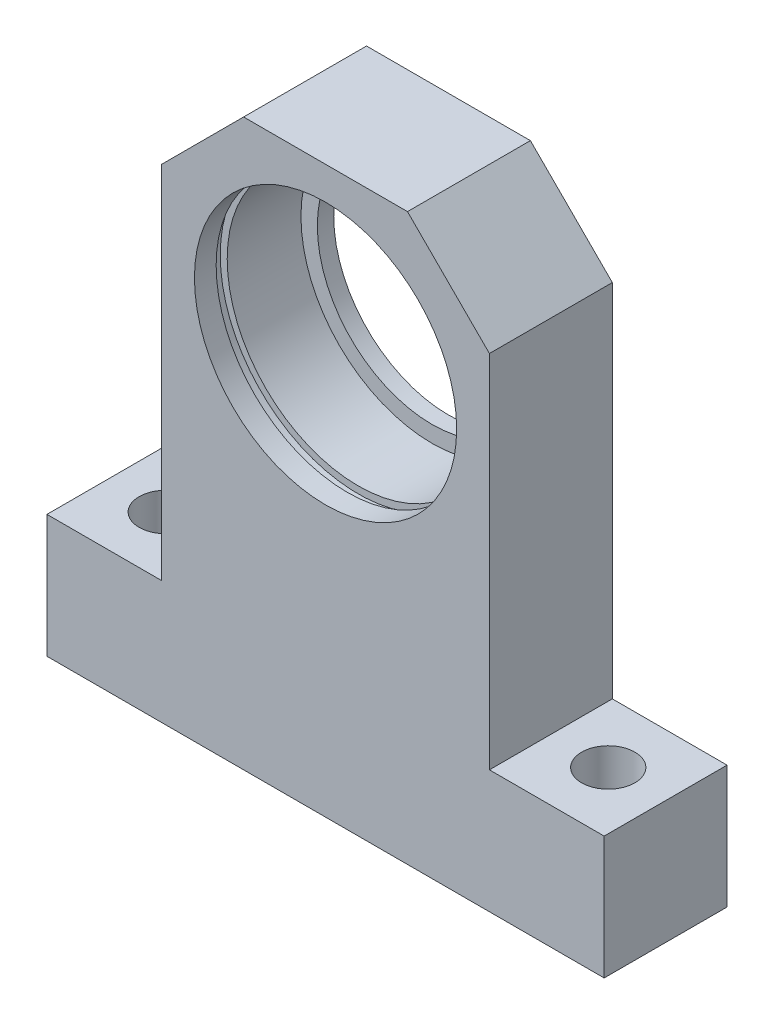
ISO-10303-21;
HEADER;
FILE_DESCRIPTION(('STEP AP214'),'2;1');
FILE_NAME('part.step','',(''),(''),'','','');
FILE_SCHEMA(('AUTOMOTIVE_DESIGN { 1 0 10303 214 1 1 1 1 }'));
ENDSEC;
DATA;
#1=APPLICATION_CONTEXT('core data for automotive mechanical design processes');
#2=APPLICATION_PROTOCOL_DEFINITION('international standard','automotive_design',2000,#1);
#3=PRODUCT_CONTEXT('',#1,'mechanical');
#4=PRODUCT('Part','Part','',(#3));
#5=PRODUCT_RELATED_PRODUCT_CATEGORY('part','',(#4));
#6=PRODUCT_DEFINITION_FORMATION('','',#4);
#7=PRODUCT_DEFINITION_CONTEXT('part definition',#1,'design');
#8=PRODUCT_DEFINITION('design','',#6,#7);
#9=PRODUCT_DEFINITION_SHAPE('','',#8);
#10=(LENGTH_UNIT() NAMED_UNIT(*) SI_UNIT(.MILLI.,.METRE.));
#11=(NAMED_UNIT(*) PLANE_ANGLE_UNIT() SI_UNIT($,.RADIAN.));
#12=(NAMED_UNIT(*) SI_UNIT($,.STERADIAN.) SOLID_ANGLE_UNIT());
#13=UNCERTAINTY_MEASURE_WITH_UNIT(LENGTH_MEASURE(1.E-05),#10,'distance_accuracy_value','');
#14=(GEOMETRIC_REPRESENTATION_CONTEXT(3) GLOBAL_UNCERTAINTY_ASSIGNED_CONTEXT((#13)) GLOBAL_UNIT_ASSIGNED_CONTEXT((#10,
#11,#12)) REPRESENTATION_CONTEXT('',''));
#15=CARTESIAN_POINT('',(0.,0.,0.));
#16=DIRECTION('',(0.,0.,1.));
#17=DIRECTION('',(1.,0.,0.));
#18=AXIS2_PLACEMENT_3D('',#15,#16,#17);
#19=CARTESIAN_POINT('',(-20.,15.,-15.));
#20=DIRECTION('',(-1.,0.,0.));
#21=DIRECTION('',(0.,-1.,0.));
#22=AXIS2_PLACEMENT_3D('',#19,#20,#21);
#23=PLANE('',#22);
#24=DIRECTION('',(0.,-1.,0.));
#25=VECTOR('',#24,1.);
#26=CARTESIAN_POINT('',(-20.,15.,0.));
#27=LINE('',#26,#25);
#28=CARTESIAN_POINT('',(-20.,59.,0.));
#29=VERTEX_POINT('',#28);
#30=CARTESIAN_POINT('',(-20.,15.,0.));
#31=VERTEX_POINT('',#30);
#32=EDGE_CURVE('E146',#29,#31,#27,.T.);
#33=ORIENTED_EDGE('',*,*,#32,.F.);
#34=DIRECTION('',(0.,0.,-1.));
#35=VECTOR('',#34,1.);
#36=CARTESIAN_POINT('',(-20.,59.,-15.));
#37=LINE('',#36,#35);
#38=CARTESIAN_POINT('',(-20.,59.,-15.));
#39=VERTEX_POINT('',#38);
#40=EDGE_CURVE('E11',#29,#39,#37,.T.);
#41=ORIENTED_EDGE('',*,*,#40,.T.);
#42=DIRECTION('',(0.,-1.,0.));
#43=VECTOR('',#42,1.);
#44=CARTESIAN_POINT('',(-20.,15.,-15.));
#45=LINE('',#44,#43);
#46=CARTESIAN_POINT('',(-20.,15.,-15.));
#47=VERTEX_POINT('',#46);
#48=EDGE_CURVE('E108',#39,#47,#45,.T.);
#49=ORIENTED_EDGE('',*,*,#48,.T.);
#50=DIRECTION('',(0.,0.,1.));
#51=VECTOR('',#50,1.);
#52=CARTESIAN_POINT('',(-20.,15.,-15.));
#53=LINE('',#52,#51);
#54=EDGE_CURVE('E110',#47,#31,#53,.T.);
#55=ORIENTED_EDGE('',*,*,#54,.T.);
#56=EDGE_LOOP('',(#33,#41,#49,#55));
#57=FACE_BOUND('',#56,.T.);
#58=ADVANCED_FACE('F33',(#57),#23,.T.);
#59=CARTESIAN_POINT('',(-20.,69.,-15.));
#60=DIRECTION('',(0.,1.,0.));
#61=DIRECTION('',(0.,0.,1.));
#62=AXIS2_PLACEMENT_3D('',#59,#60,#61);
#63=PLANE('',#62);
#64=DIRECTION('',(-1.,0.,0.));
#65=VECTOR('',#64,1.);
#66=CARTESIAN_POINT('',(-20.,69.,0.));
#67=LINE('',#66,#65);
#68=CARTESIAN_POINT('',(9.99999999999996,69.,0.));
#69=VERTEX_POINT('',#68);
#70=CARTESIAN_POINT('',(-10.,69.,0.));
#71=VERTEX_POINT('',#70);
#72=EDGE_CURVE('E114',#69,#71,#67,.T.);
#73=ORIENTED_EDGE('',*,*,#72,.F.);
#74=DIRECTION('',(0.,0.,-1.));
#75=VECTOR('',#74,1.);
#76=CARTESIAN_POINT('',(9.99999999999996,69.,-15.));
#77=LINE('',#76,#75);
#78=CARTESIAN_POINT('',(9.99999999999996,69.,-15.));
#79=VERTEX_POINT('',#78);
#80=EDGE_CURVE('E186',#69,#79,#77,.T.);
#81=ORIENTED_EDGE('',*,*,#80,.T.);
#82=DIRECTION('',(-1.,0.,0.));
#83=VECTOR('',#82,1.);
#84=CARTESIAN_POINT('',(-20.,69.,-15.));
#85=LINE('',#84,#83);
#86=CARTESIAN_POINT('',(-10.,69.,-15.));
#87=VERTEX_POINT('',#86);
#88=EDGE_CURVE('E122',#79,#87,#85,.T.);
#89=ORIENTED_EDGE('',*,*,#88,.T.);
#90=DIRECTION('',(0.,0.,1.));
#91=VECTOR('',#90,1.);
#92=CARTESIAN_POINT('',(-10.,69.,-15.));
#93=LINE('',#92,#91);
#94=EDGE_CURVE('E183',#87,#71,#93,.T.);
#95=ORIENTED_EDGE('',*,*,#94,.T.);
#96=EDGE_LOOP('',(#73,#81,#89,#95));
#97=FACE_BOUND('',#96,.T.);
#98=ADVANCED_FACE('F202',(#97),#63,.T.);
#99=CARTESIAN_POINT('',(20.,69.,-15.));
#100=DIRECTION('',(1.,0.,0.));
#101=DIRECTION('',(0.,1.,0.));
#102=AXIS2_PLACEMENT_3D('',#99,#100,#101);
#103=PLANE('',#102);
#104=DIRECTION('',(0.,1.,0.));
#105=VECTOR('',#104,1.);
#106=CARTESIAN_POINT('',(20.,69.,-15.));
#107=LINE('',#106,#105);
#108=CARTESIAN_POINT('',(20.,15.,-15.));
#109=VERTEX_POINT('',#108);
#110=CARTESIAN_POINT('',(20.,59.,-15.));
#111=VERTEX_POINT('',#110);
#112=EDGE_CURVE('E142',#109,#111,#107,.T.);
#113=ORIENTED_EDGE('',*,*,#112,.T.);
#114=DIRECTION('',(0.,0.,1.));
#115=VECTOR('',#114,1.);
#116=CARTESIAN_POINT('',(20.,59.,-15.));
#117=LINE('',#116,#115);
#118=CARTESIAN_POINT('',(20.,59.,0.));
#119=VERTEX_POINT('',#118);
#120=EDGE_CURVE('E169',#111,#119,#117,.T.);
#121=ORIENTED_EDGE('',*,*,#120,.T.);
#122=DIRECTION('',(0.,1.,0.));
#123=VECTOR('',#122,1.);
#124=CARTESIAN_POINT('',(20.,69.,0.));
#125=LINE('',#124,#123);
#126=CARTESIAN_POINT('',(20.,15.,0.));
#127=VERTEX_POINT('',#126);
#128=EDGE_CURVE('E162',#127,#119,#125,.T.);
#129=ORIENTED_EDGE('',*,*,#128,.F.);
#130=DIRECTION('',(0.,0.,1.));
#131=VECTOR('',#130,1.);
#132=CARTESIAN_POINT('',(20.,15.,-15.));
#133=LINE('',#132,#131);
#134=EDGE_CURVE('E167',#109,#127,#133,.T.);
#135=ORIENTED_EDGE('',*,*,#134,.F.);
#136=EDGE_LOOP('',(#113,#121,#129,#135));
#137=FACE_BOUND('',#136,.T.);
#138=ADVANCED_FACE('F195',(#137),#103,.T.);
#139=CARTESIAN_POINT('',(20.,15.,-15.));
#140=DIRECTION('',(0.,1.,0.));
#141=DIRECTION('',(-1.,0.,0.));
#142=AXIS2_PLACEMENT_3D('',#139,#140,#141);
#143=PLANE('',#142);
#144=CARTESIAN_POINT('',(27.,15.,-7.5));
#145=DIRECTION('',(0.,1.,0.));
#146=DIRECTION('',(0.,0.,1.));
#147=AXIS2_PLACEMENT_3D('',#144,#145,#146);
#148=CIRCLE('',#147,3.25);
#149=CARTESIAN_POINT('',(27.,15.,-4.25));
#150=VERTEX_POINT('',#149);
#151=EDGE_CURVE('E315',#150,#150,#148,.T.);
#152=ORIENTED_EDGE('',*,*,#151,.F.);
#153=EDGE_LOOP('',(#152));
#154=FACE_BOUND('',#153,.T.);
#155=DIRECTION('',(-1.,0.,0.));
#156=VECTOR('',#155,1.);
#157=CARTESIAN_POINT('',(20.,15.,0.));
#158=LINE('',#157,#156);
#159=CARTESIAN_POINT('',(34.,15.,0.));
#160=VERTEX_POINT('',#159);
#161=EDGE_CURVE('E159',#160,#127,#158,.T.);
#162=ORIENTED_EDGE('',*,*,#161,.F.);
#163=DIRECTION('',(0.,0.,1.));
#164=VECTOR('',#163,1.);
#165=CARTESIAN_POINT('',(34.,15.,-15.));
#166=LINE('',#165,#164);
#167=CARTESIAN_POINT('',(34.,15.,-15.));
#168=VERTEX_POINT('',#167);
#169=EDGE_CURVE('E170',#168,#160,#166,.T.);
#170=ORIENTED_EDGE('',*,*,#169,.F.);
#171=DIRECTION('',(-1.,0.,0.));
#172=VECTOR('',#171,1.);
#173=CARTESIAN_POINT('',(20.,15.,-15.));
#174=LINE('',#173,#172);
#175=EDGE_CURVE('E139',#168,#109,#174,.T.);
#176=ORIENTED_EDGE('',*,*,#175,.T.);
#177=ORIENTED_EDGE('',*,*,#134,.T.);
#178=EDGE_LOOP('',(#162,#170,#176,#177));
#179=FACE_BOUND('',#178,.T.);
#180=ADVANCED_FACE('F217',(#154,#179),#143,.T.);
#181=CARTESIAN_POINT('',(34.,15.,-15.));
#182=DIRECTION('',(1.,0.,0.));
#183=DIRECTION('',(0.,0.,-1.));
#184=AXIS2_PLACEMENT_3D('',#181,#182,#183);
#185=PLANE('',#184);
#186=DIRECTION('',(0.,1.,0.));
#187=VECTOR('',#186,1.);
#188=CARTESIAN_POINT('',(34.,15.,0.));
#189=LINE('',#188,#187);
#190=CARTESIAN_POINT('',(34.,0.,0.));
#191=VERTEX_POINT('',#190);
#192=EDGE_CURVE('E156',#191,#160,#189,.T.);
#193=ORIENTED_EDGE('',*,*,#192,.F.);
#194=DIRECTION('',(0.,0.,1.));
#195=VECTOR('',#194,1.);
#196=CARTESIAN_POINT('',(34.,0.,-15.));
#197=LINE('',#196,#195);
#198=CARTESIAN_POINT('',(34.,0.,-15.));
#199=VERTEX_POINT('',#198);
#200=EDGE_CURVE('E172',#199,#191,#197,.T.);
#201=ORIENTED_EDGE('',*,*,#200,.F.);
#202=DIRECTION('',(0.,1.,0.));
#203=VECTOR('',#202,1.);
#204=CARTESIAN_POINT('',(34.,15.,-15.));
#205=LINE('',#204,#203);
#206=EDGE_CURVE('E136',#199,#168,#205,.T.);
#207=ORIENTED_EDGE('',*,*,#206,.T.);
#208=ORIENTED_EDGE('',*,*,#169,.T.);
#209=EDGE_LOOP('',(#193,#201,#207,#208));
#210=FACE_BOUND('',#209,.T.);
#211=ADVANCED_FACE('F214',(#210),#185,.T.);
#212=CARTESIAN_POINT('',(34.,0.,-15.));
#213=DIRECTION('',(0.,-1.,0.));
#214=DIRECTION('',(0.,0.,-1.));
#215=AXIS2_PLACEMENT_3D('',#212,#213,#214);
#216=PLANE('',#215);
#217=CARTESIAN_POINT('',(-27.,0.,-7.5));
#218=DIRECTION('',(0.,1.,0.));
#219=DIRECTION('',(0.,0.,1.));
#220=AXIS2_PLACEMENT_3D('',#217,#218,#219);
#221=CIRCLE('',#220,3.25);
#222=CARTESIAN_POINT('',(-27.,0.,-4.25));
#223=VERTEX_POINT('',#222);
#224=EDGE_CURVE('E318',#223,#223,#221,.T.);
#225=ORIENTED_EDGE('',*,*,#224,.T.);
#226=EDGE_LOOP('',(#225));
#227=FACE_BOUND('',#226,.T.);
#228=CARTESIAN_POINT('',(27.,0.,-7.5));
#229=DIRECTION('',(0.,1.,0.));
#230=DIRECTION('',(0.,0.,1.));
#231=AXIS2_PLACEMENT_3D('',#228,#229,#230);
#232=CIRCLE('',#231,3.25);
#233=CARTESIAN_POINT('',(27.,0.,-4.25));
#234=VERTEX_POINT('',#233);
#235=EDGE_CURVE('E312',#234,#234,#232,.T.);
#236=ORIENTED_EDGE('',*,*,#235,.T.);
#237=EDGE_LOOP('',(#236));
#238=FACE_BOUND('',#237,.T.);
#239=DIRECTION('',(1.,0.,0.));
#240=VECTOR('',#239,1.);
#241=CARTESIAN_POINT('',(34.,0.,0.));
#242=LINE('',#241,#240);
#243=CARTESIAN_POINT('',(-34.,0.,0.));
#244=VERTEX_POINT('',#243);
#245=EDGE_CURVE('E153',#244,#191,#242,.T.);
#246=ORIENTED_EDGE('',*,*,#245,.F.);
#247=DIRECTION('',(0.,0.,1.));
#248=VECTOR('',#247,1.);
#249=CARTESIAN_POINT('',(-34.,0.,-15.));
#250=LINE('',#249,#248);
#251=CARTESIAN_POINT('',(-34.,0.,-15.));
#252=VERTEX_POINT('',#251);
#253=EDGE_CURVE('E174',#252,#244,#250,.T.);
#254=ORIENTED_EDGE('',*,*,#253,.F.);
#255=DIRECTION('',(1.,0.,0.));
#256=VECTOR('',#255,1.);
#257=CARTESIAN_POINT('',(34.,0.,-15.));
#258=LINE('',#257,#256);
#259=EDGE_CURVE('E130',#252,#199,#258,.T.);
#260=ORIENTED_EDGE('',*,*,#259,.T.);
#261=ORIENTED_EDGE('',*,*,#200,.T.);
#262=EDGE_LOOP('',(#246,#254,#260,#261));
#263=FACE_BOUND('',#262,.T.);
#264=ADVANCED_FACE('F210',(#227,#238,#263),#216,.T.);
#265=CARTESIAN_POINT('',(-34.,0.,-15.));
#266=DIRECTION('',(-1.,0.,0.));
#267=DIRECTION('',(0.,0.,1.));
#268=AXIS2_PLACEMENT_3D('',#265,#266,#267);
#269=PLANE('',#268);
#270=DIRECTION('',(0.,-1.,0.));
#271=VECTOR('',#270,1.);
#272=CARTESIAN_POINT('',(-34.,0.,0.));
#273=LINE('',#272,#271);
#274=CARTESIAN_POINT('',(-34.,15.,0.));
#275=VERTEX_POINT('',#274);
#276=EDGE_CURVE('E150',#275,#244,#273,.T.);
#277=ORIENTED_EDGE('',*,*,#276,.F.);
#278=DIRECTION('',(0.,0.,1.));
#279=VECTOR('',#278,1.);
#280=CARTESIAN_POINT('',(-34.,15.,-15.));
#281=LINE('',#280,#279);
#282=CARTESIAN_POINT('',(-34.,15.,-15.));
#283=VERTEX_POINT('',#282);
#284=EDGE_CURVE('E121',#283,#275,#281,.T.);
#285=ORIENTED_EDGE('',*,*,#284,.F.);
#286=DIRECTION('',(0.,-1.,0.));
#287=VECTOR('',#286,1.);
#288=CARTESIAN_POINT('',(-34.,0.,-15.));
#289=LINE('',#288,#287);
#290=EDGE_CURVE('E128',#283,#252,#289,.T.);
#291=ORIENTED_EDGE('',*,*,#290,.T.);
#292=ORIENTED_EDGE('',*,*,#253,.T.);
#293=EDGE_LOOP('',(#277,#285,#291,#292));
#294=FACE_BOUND('',#293,.T.);
#295=ADVANCED_FACE('F208',(#294),#269,.T.);
#296=CARTESIAN_POINT('',(-34.,15.,-15.));
#297=DIRECTION('',(0.,1.,0.));
#298=DIRECTION('',(0.,0.,1.));
#299=AXIS2_PLACEMENT_3D('',#296,#297,#298);
#300=PLANE('',#299);
#301=CARTESIAN_POINT('',(-27.,15.,-7.5));
#302=DIRECTION('',(0.,1.,0.));
#303=DIRECTION('',(0.,0.,1.));
#304=AXIS2_PLACEMENT_3D('',#301,#302,#303);
#305=CIRCLE('',#304,3.25);
#306=CARTESIAN_POINT('',(-27.,15.,-4.25));
#307=VERTEX_POINT('',#306);
#308=EDGE_CURVE('E321',#307,#307,#305,.T.);
#309=ORIENTED_EDGE('',*,*,#308,.F.);
#310=EDGE_LOOP('',(#309));
#311=FACE_BOUND('',#310,.T.);
#312=DIRECTION('',(-1.,0.,0.));
#313=VECTOR('',#312,1.);
#314=CARTESIAN_POINT('',(-34.,15.,0.));
#315=LINE('',#314,#313);
#316=EDGE_CURVE('E120',#31,#275,#315,.T.);
#317=ORIENTED_EDGE('',*,*,#316,.F.);
#318=ORIENTED_EDGE('',*,*,#54,.F.);
#319=DIRECTION('',(-1.,0.,0.));
#320=VECTOR('',#319,1.);
#321=CARTESIAN_POINT('',(-34.,15.,-15.));
#322=LINE('',#321,#320);
#323=EDGE_CURVE('E113',#47,#283,#322,.T.);
#324=ORIENTED_EDGE('',*,*,#323,.T.);
#325=ORIENTED_EDGE('',*,*,#284,.T.);
#326=EDGE_LOOP('',(#317,#318,#324,#325));
#327=FACE_BOUND('',#326,.T.);
#328=ADVANCED_FACE('F118',(#311,#327),#300,.T.);
#329=CARTESIAN_POINT('',(0.,0.,-15.));
#330=DIRECTION('',(0.,0.,-1.));
#331=DIRECTION('',(-1.,0.,0.));
#332=AXIS2_PLACEMENT_3D('',#329,#330,#331);
#333=PLANE('',#332);
#334=CARTESIAN_POINT('',(0.,49.,-15.));
#335=DIRECTION('',(0.,0.,-1.));
#336=DIRECTION('',(-1.,0.,0.));
#337=AXIS2_PLACEMENT_3D('',#334,#335,#336);
#338=CIRCLE('',#337,14.);
#339=CARTESIAN_POINT('',(-14.,49.,-15.));
#340=VERTEX_POINT('',#339);
#341=EDGE_CURVE('E290',#340,#340,#338,.T.);
#342=ORIENTED_EDGE('',*,*,#341,.F.);
#343=EDGE_LOOP('',(#342));
#344=FACE_BOUND('',#343,.T.);
#345=ORIENTED_EDGE('',*,*,#88,.F.);
#346=DIRECTION('',(-0.70710678118655,0.707106781186546,0.));
#347=VECTOR('',#346,1.);
#348=CARTESIAN_POINT('',(39.4999999999999,39.5000000000002,-15.));
#349=LINE('',#348,#347);
#350=EDGE_CURVE('E41',#79,#111,#349,.F.);
#351=ORIENTED_EDGE('',*,*,#350,.T.);
#352=ORIENTED_EDGE('',*,*,#112,.F.);
#353=ORIENTED_EDGE('',*,*,#175,.F.);
#354=ORIENTED_EDGE('',*,*,#206,.F.);
#355=ORIENTED_EDGE('',*,*,#259,.F.);
#356=ORIENTED_EDGE('',*,*,#290,.F.);
#357=ORIENTED_EDGE('',*,*,#323,.F.);
#358=ORIENTED_EDGE('',*,*,#48,.F.);
#359=DIRECTION('',(-0.707106781186546,-0.707106781186549,0.));
#360=VECTOR('',#359,1.);
#361=CARTESIAN_POINT('',(-39.5,39.4999999999999,-15.));
#362=LINE('',#361,#360);
#363=EDGE_CURVE('E53',#39,#87,#362,.F.);
#364=ORIENTED_EDGE('',*,*,#363,.T.);
#365=EDGE_LOOP('',(#345,#351,#352,#353,#354,#355,#356,#357,#358,#364));
#366=FACE_BOUND('',#365,.T.);
#367=ADVANCED_FACE('F125',(#344,#366),#333,.T.);
#368=CARTESIAN_POINT('',(0.,0.,0.));
#369=DIRECTION('',(0.,0.,-1.));
#370=DIRECTION('',(-1.,0.,0.));
#371=AXIS2_PLACEMENT_3D('',#368,#369,#370);
#372=PLANE('',#371);
#373=CARTESIAN_POINT('',(0.,49.,0.));
#374=DIRECTION('',(0.,0.,-1.));
#375=DIRECTION('',(-1.,0.,0.));
#376=AXIS2_PLACEMENT_3D('',#373,#374,#375);
#377=CIRCLE('',#376,16.);
#378=CARTESIAN_POINT('',(-16.,49.,0.));
#379=VERTEX_POINT('',#378);
#380=EDGE_CURVE('E148',#379,#379,#377,.T.);
#381=ORIENTED_EDGE('',*,*,#380,.T.);
#382=EDGE_LOOP('',(#381));
#383=FACE_BOUND('',#382,.T.);
#384=ORIENTED_EDGE('',*,*,#128,.T.);
#385=DIRECTION('',(0.70710678118655,-0.707106781186546,0.));
#386=VECTOR('',#385,1.);
#387=CARTESIAN_POINT('',(20.,59.,0.));
#388=LINE('',#387,#386);
#389=EDGE_CURVE('E181',#119,#69,#388,.F.);
#390=ORIENTED_EDGE('',*,*,#389,.T.);
#391=ORIENTED_EDGE('',*,*,#72,.T.);
#392=DIRECTION('',(0.707106781186546,0.707106781186549,0.));
#393=VECTOR('',#392,1.);
#394=CARTESIAN_POINT('',(-10.,69.,0.));
#395=LINE('',#394,#393);
#396=EDGE_CURVE('E179',#71,#29,#395,.F.);
#397=ORIENTED_EDGE('',*,*,#396,.T.);
#398=ORIENTED_EDGE('',*,*,#32,.T.);
#399=ORIENTED_EDGE('',*,*,#316,.T.);
#400=ORIENTED_EDGE('',*,*,#276,.T.);
#401=ORIENTED_EDGE('',*,*,#245,.T.);
#402=ORIENTED_EDGE('',*,*,#192,.T.);
#403=ORIENTED_EDGE('',*,*,#161,.T.);
#404=EDGE_LOOP('',(#384,#390,#391,#397,#398,#399,#400,#401,#402,#403));
#405=FACE_BOUND('',#404,.T.);
#406=ADVANCED_FACE('F200',(#383,#405),#372,.F.);
#407=CARTESIAN_POINT('',(0.,49.,-15.));
#408=DIRECTION('',(0.,0.,-1.));
#409=DIRECTION('',(-1.,0.,0.));
#410=AXIS2_PLACEMENT_3D('',#407,#408,#409);
#411=CYLINDRICAL_SURFACE('',#410,16.);
#412=ORIENTED_EDGE('',*,*,#380,.F.);
#413=EDGE_LOOP('',(#412));
#414=FACE_BOUND('',#413,.T.);
#415=CARTESIAN_POINT('',(0.,49.,-2.65));
#416=DIRECTION('',(0.,0.,-1.));
#417=DIRECTION('',(-1.,0.,0.));
#418=AXIS2_PLACEMENT_3D('',#415,#416,#417);
#419=CIRCLE('',#418,16.);
#420=CARTESIAN_POINT('',(-16.,49.,-2.65));
#421=VERTEX_POINT('',#420);
#422=EDGE_CURVE('E309',#421,#421,#419,.T.);
#423=ORIENTED_EDGE('',*,*,#422,.T.);
#424=EDGE_LOOP('',(#423));
#425=FACE_BOUND('',#424,.T.);
#426=ADVANCED_FACE('F276',(#414,#425),#411,.F.);
#427=CARTESIAN_POINT('',(0.,49.,-15.));
#428=DIRECTION('',(0.,0.,-1.));
#429=DIRECTION('',(-1.,0.,0.));
#430=AXIS2_PLACEMENT_3D('',#427,#428,#429);
#431=CYLINDRICAL_SURFACE('',#430,14.);
#432=CARTESIAN_POINT('',(0.,49.,-13.));
#433=DIRECTION('',(0.,0.,-1.));
#434=DIRECTION('',(-1.,0.,0.));
#435=AXIS2_PLACEMENT_3D('',#432,#433,#434);
#436=CIRCLE('',#435,14.);
#437=CARTESIAN_POINT('',(-14.,49.,-13.));
#438=VERTEX_POINT('',#437);
#439=EDGE_CURVE('E292',#438,#438,#436,.T.);
#440=ORIENTED_EDGE('',*,*,#439,.F.);
#441=EDGE_LOOP('',(#440));
#442=FACE_BOUND('',#441,.T.);
#443=ORIENTED_EDGE('',*,*,#341,.T.);
#444=EDGE_LOOP('',(#443));
#445=FACE_BOUND('',#444,.T.);
#446=ADVANCED_FACE('F272',(#442,#445),#431,.F.);
#447=CARTESIAN_POINT('',(0.,65.,-13.));
#448=DIRECTION('',(0.,0.,-1.));
#449=DIRECTION('',(-1.,0.,0.));
#450=AXIS2_PLACEMENT_3D('',#447,#448,#449);
#451=PLANE('',#450);
#452=CARTESIAN_POINT('',(0.,49.,-13.));
#453=DIRECTION('',(0.,0.,-1.));
#454=DIRECTION('',(-1.,0.,0.));
#455=AXIS2_PLACEMENT_3D('',#452,#453,#454);
#456=CIRCLE('',#455,16.);
#457=CARTESIAN_POINT('',(-16.,49.,-13.));
#458=VERTEX_POINT('',#457);
#459=EDGE_CURVE('E297',#458,#458,#456,.T.);
#460=ORIENTED_EDGE('',*,*,#459,.F.);
#461=EDGE_LOOP('',(#460));
#462=FACE_BOUND('',#461,.T.);
#463=ORIENTED_EDGE('',*,*,#439,.T.);
#464=EDGE_LOOP('',(#463));
#465=FACE_BOUND('',#464,.T.);
#466=ADVANCED_FACE('F268',(#462,#465),#451,.F.);
#467=CARTESIAN_POINT('',(0.,49.,-15.));
#468=DIRECTION('',(0.,0.,-1.));
#469=DIRECTION('',(-1.,0.,0.));
#470=AXIS2_PLACEMENT_3D('',#467,#468,#469);
#471=CYLINDRICAL_SURFACE('',#470,16.);
#472=CARTESIAN_POINT('',(0.,49.,-4.));
#473=DIRECTION('',(0.,0.,-1.));
#474=DIRECTION('',(-1.,0.,0.));
#475=AXIS2_PLACEMENT_3D('',#472,#473,#474);
#476=CIRCLE('',#475,16.);
#477=CARTESIAN_POINT('',(-16.,49.,-4.));
#478=VERTEX_POINT('',#477);
#479=EDGE_CURVE('E300',#478,#478,#476,.T.);
#480=ORIENTED_EDGE('',*,*,#479,.F.);
#481=EDGE_LOOP('',(#480));
#482=FACE_BOUND('',#481,.T.);
#483=ORIENTED_EDGE('',*,*,#459,.T.);
#484=EDGE_LOOP('',(#483));
#485=FACE_BOUND('',#484,.T.);
#486=ADVANCED_FACE('F264',(#482,#485),#471,.F.);
#487=CARTESIAN_POINT('',(0.,65.85,-4.));
#488=DIRECTION('',(0.,0.,-1.));
#489=DIRECTION('',(-1.,0.,0.));
#490=AXIS2_PLACEMENT_3D('',#487,#488,#489);
#491=PLANE('',#490);
#492=CARTESIAN_POINT('',(0.,49.,-4.));
#493=DIRECTION('',(0.,0.,-1.));
#494=DIRECTION('',(-1.,0.,0.));
#495=AXIS2_PLACEMENT_3D('',#492,#493,#494);
#496=CIRCLE('',#495,16.85);
#497=CARTESIAN_POINT('',(-16.85,49.,-4.));
#498=VERTEX_POINT('',#497);
#499=EDGE_CURVE('E303',#498,#498,#496,.T.);
#500=ORIENTED_EDGE('',*,*,#499,.F.);
#501=EDGE_LOOP('',(#500));
#502=FACE_BOUND('',#501,.T.);
#503=ORIENTED_EDGE('',*,*,#479,.T.);
#504=EDGE_LOOP('',(#503));
#505=FACE_BOUND('',#504,.T.);
#506=ADVANCED_FACE('F260',(#502,#505),#491,.F.);
#507=CARTESIAN_POINT('',(0.,49.,-15.));
#508=DIRECTION('',(0.,0.,-1.));
#509=DIRECTION('',(-1.,0.,0.));
#510=AXIS2_PLACEMENT_3D('',#507,#508,#509);
#511=CYLINDRICAL_SURFACE('',#510,16.85);
#512=CARTESIAN_POINT('',(0.,49.,-2.65));
#513=DIRECTION('',(0.,0.,-1.));
#514=DIRECTION('',(-1.,0.,0.));
#515=AXIS2_PLACEMENT_3D('',#512,#513,#514);
#516=CIRCLE('',#515,16.85);
#517=CARTESIAN_POINT('',(-16.85,49.,-2.65));
#518=VERTEX_POINT('',#517);
#519=EDGE_CURVE('E306',#518,#518,#516,.T.);
#520=ORIENTED_EDGE('',*,*,#519,.F.);
#521=EDGE_LOOP('',(#520));
#522=FACE_BOUND('',#521,.T.);
#523=ORIENTED_EDGE('',*,*,#499,.T.);
#524=EDGE_LOOP('',(#523));
#525=FACE_BOUND('',#524,.T.);
#526=ADVANCED_FACE('F256',(#522,#525),#511,.F.);
#527=CARTESIAN_POINT('',(0.,65.,-2.65));
#528=DIRECTION('',(0.,0.,1.));
#529=DIRECTION('',(1.,0.,0.));
#530=AXIS2_PLACEMENT_3D('',#527,#528,#529);
#531=PLANE('',#530);
#532=ORIENTED_EDGE('',*,*,#422,.F.);
#533=EDGE_LOOP('',(#532));
#534=FACE_BOUND('',#533,.T.);
#535=ORIENTED_EDGE('',*,*,#519,.T.);
#536=EDGE_LOOP('',(#535));
#537=FACE_BOUND('',#536,.T.);
#538=ADVANCED_FACE('F248',(#534,#537),#531,.F.);
#539=CARTESIAN_POINT('',(27.,15.,-7.5));
#540=DIRECTION('',(0.,1.,0.));
#541=DIRECTION('',(0.,0.,1.));
#542=AXIS2_PLACEMENT_3D('',#539,#540,#541);
#543=CYLINDRICAL_SURFACE('',#542,3.25);
#544=ORIENTED_EDGE('',*,*,#235,.F.);
#545=EDGE_LOOP('',(#544));
#546=FACE_BOUND('',#545,.T.);
#547=ORIENTED_EDGE('',*,*,#151,.T.);
#548=EDGE_LOOP('',(#547));
#549=FACE_BOUND('',#548,.T.);
#550=ADVANCED_FACE('F242',(#546,#549),#543,.F.);
#551=CARTESIAN_POINT('',(-27.,15.,-7.5));
#552=DIRECTION('',(0.,1.,0.));
#553=DIRECTION('',(0.,0.,1.));
#554=AXIS2_PLACEMENT_3D('',#551,#552,#553);
#555=CYLINDRICAL_SURFACE('',#554,3.25);
#556=ORIENTED_EDGE('',*,*,#224,.F.);
#557=EDGE_LOOP('',(#556));
#558=FACE_BOUND('',#557,.T.);
#559=ORIENTED_EDGE('',*,*,#308,.T.);
#560=EDGE_LOOP('',(#559));
#561=FACE_BOUND('',#560,.T.);
#562=ADVANCED_FACE('F237',(#558,#561),#555,.F.);
#563=CARTESIAN_POINT('',(20.,59.,-15.));
#564=DIRECTION('',(-0.707106781186545,-0.707106781186549,0.));
#565=DIRECTION('',(0.,0.,1.));
#566=AXIS2_PLACEMENT_3D('',#563,#564,#565);
#567=PLANE('',#566);
#568=ORIENTED_EDGE('',*,*,#350,.F.);
#569=ORIENTED_EDGE('',*,*,#80,.F.);
#570=ORIENTED_EDGE('',*,*,#389,.F.);
#571=ORIENTED_EDGE('',*,*,#120,.F.);
#572=EDGE_LOOP('',(#568,#569,#570,#571));
#573=FACE_BOUND('',#572,.T.);
#574=ADVANCED_FACE('F197',(#573),#567,.F.);
#575=CARTESIAN_POINT('',(-10.,69.,-15.));
#576=DIRECTION('',(0.707106781186549,-0.707106781186546,0.));
#577=DIRECTION('',(0.,0.,1.));
#578=AXIS2_PLACEMENT_3D('',#575,#576,#577);
#579=PLANE('',#578);
#580=ORIENTED_EDGE('',*,*,#363,.F.);
#581=ORIENTED_EDGE('',*,*,#40,.F.);
#582=ORIENTED_EDGE('',*,*,#396,.F.);
#583=ORIENTED_EDGE('',*,*,#94,.F.);
#584=EDGE_LOOP('',(#580,#581,#582,#583));
#585=FACE_BOUND('',#584,.T.);
#586=ADVANCED_FACE('F35',(#585),#579,.F.);
#587=CLOSED_SHELL('',(#58,#98,#138,#180,#211,#264,#295,#328,#367,#406,#426,#446,#466,#486,#506,
#526,#538,#550,#562,#574,#586));
#588=MANIFOLD_SOLID_BREP('B2',#587);
#589=ADVANCED_BREP_SHAPE_REPRESENTATION('',(#18,#588),#14);
#590=SHAPE_DEFINITION_REPRESENTATION(#9,#589);
ENDSEC;
END-ISO-10303-21;
